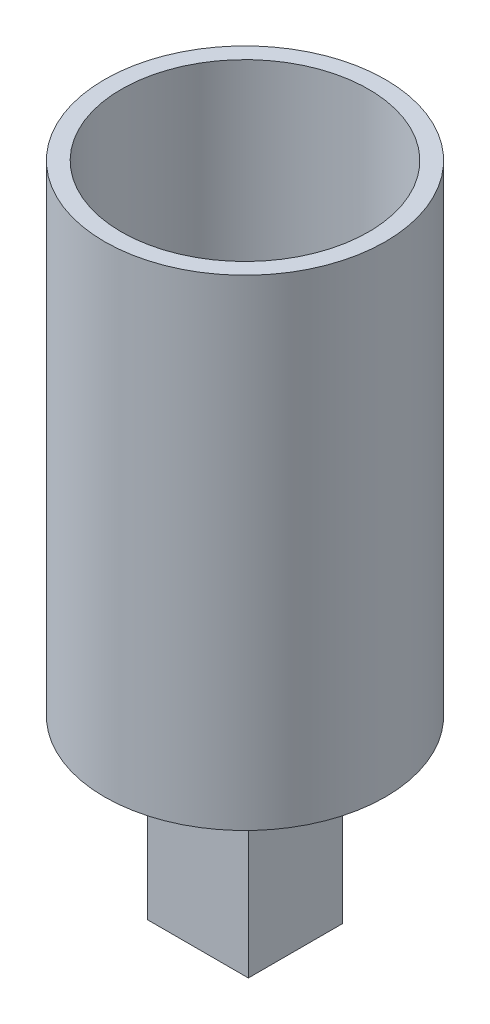
ISO-10303-21;
HEADER;
FILE_DESCRIPTION(('STEP AP214'),'2;1');
FILE_NAME('part.step','',(''),(''),'','','');
FILE_SCHEMA(('AUTOMOTIVE_DESIGN { 1 0 10303 214 1 1 1 1 }'));
ENDSEC;
DATA;
#1=APPLICATION_CONTEXT('core data for automotive mechanical design processes');
#2=APPLICATION_PROTOCOL_DEFINITION('international standard','automotive_design',2000,#1);
#3=PRODUCT_CONTEXT('',#1,'mechanical');
#4=PRODUCT('Part','Part','',(#3));
#5=PRODUCT_RELATED_PRODUCT_CATEGORY('part','',(#4));
#6=PRODUCT_DEFINITION_FORMATION('','',#4);
#7=PRODUCT_DEFINITION_CONTEXT('part definition',#1,'design');
#8=PRODUCT_DEFINITION('design','',#6,#7);
#9=PRODUCT_DEFINITION_SHAPE('','',#8);
#10=(LENGTH_UNIT() NAMED_UNIT(*) SI_UNIT(.MILLI.,.METRE.));
#11=(NAMED_UNIT(*) PLANE_ANGLE_UNIT() SI_UNIT($,.RADIAN.));
#12=(NAMED_UNIT(*) SI_UNIT($,.STERADIAN.) SOLID_ANGLE_UNIT());
#13=UNCERTAINTY_MEASURE_WITH_UNIT(LENGTH_MEASURE(1.E-05),#10,'distance_accuracy_value','');
#14=(GEOMETRIC_REPRESENTATION_CONTEXT(3) GLOBAL_UNCERTAINTY_ASSIGNED_CONTEXT((#13)) GLOBAL_UNIT_ASSIGNED_CONTEXT((#10,
#11,#12)) REPRESENTATION_CONTEXT('',''));
#15=CARTESIAN_POINT('',(0.,0.,0.));
#16=DIRECTION('',(0.,0.,1.));
#17=DIRECTION('',(1.,0.,0.));
#18=AXIS2_PLACEMENT_3D('',#15,#16,#17);
#19=CARTESIAN_POINT('',(8.49999999999998,-142.99499992,-9.00000000000003));
#20=DIRECTION('',(0.,1.,0.));
#21=DIRECTION('',(-1.,0.,0.));
#22=AXIS2_PLACEMENT_3D('',#19,#20,#21);
#23=PLANE('',#22);
#24=CARTESIAN_POINT('',(0.,-142.99499992,0.));
#25=DIRECTION('',(0.,1.,0.));
#26=DIRECTION('',(0.,0.,1.));
#27=AXIS2_PLACEMENT_3D('',#24,#25,#26);
#28=CIRCLE('',#27,41.765999938);
#29=CARTESIAN_POINT('',(0.,-142.99499992,41.765999938));
#30=VERTEX_POINT('',#29);
#31=EDGE_CURVE('E42',#30,#30,#28,.F.);
#32=ORIENTED_EDGE('',*,*,#31,.T.);
#33=EDGE_LOOP('',(#32));
#34=FACE_BOUND('',#33,.T.);
#35=DIRECTION('',(1.,0.,0.));
#36=VECTOR('',#35,1.);
#37=CARTESIAN_POINT('',(15.,-142.99499992,-14.));
#38=LINE('',#37,#36);
#39=CARTESIAN_POINT('',(-15.,-142.99499992,-14.));
#40=VERTEX_POINT('',#39);
#41=CARTESIAN_POINT('',(15.,-142.99499992,-14.));
#42=VERTEX_POINT('',#41);
#43=EDGE_CURVE('E140',#40,#42,#38,.T.);
#44=ORIENTED_EDGE('',*,*,#43,.F.);
#45=DIRECTION('',(0.,0.,-1.));
#46=VECTOR('',#45,1.);
#47=CARTESIAN_POINT('',(-15.,-142.99499992,-14.));
#48=LINE('',#47,#46);
#49=CARTESIAN_POINT('',(-15.,-142.99499992,14.));
#50=VERTEX_POINT('',#49);
#51=EDGE_CURVE('E168',#50,#40,#48,.T.);
#52=ORIENTED_EDGE('',*,*,#51,.F.);
#53=DIRECTION('',(-1.,0.,0.));
#54=VECTOR('',#53,1.);
#55=CARTESIAN_POINT('',(15.,-142.99499992,14.));
#56=LINE('',#55,#54);
#57=CARTESIAN_POINT('',(15.,-142.99499992,14.));
#58=VERTEX_POINT('',#57);
#59=EDGE_CURVE('E54',#58,#50,#56,.T.);
#60=ORIENTED_EDGE('',*,*,#59,.F.);
#61=DIRECTION('',(0.,0.,1.));
#62=VECTOR('',#61,1.);
#63=CARTESIAN_POINT('',(15.,-142.99499992,-14.));
#64=LINE('',#63,#62);
#65=EDGE_CURVE('E49',#42,#58,#64,.T.);
#66=ORIENTED_EDGE('',*,*,#65,.F.);
#67=EDGE_LOOP('',(#44,#52,#60,#66));
#68=FACE_BOUND('',#67,.T.);
#69=ADVANCED_FACE('F34',(#34,#68),#23,.F.);
#70=CARTESIAN_POINT('',(0.,-261.127087036787,0.));
#71=DIRECTION('',(0.,1.,0.));
#72=DIRECTION('',(0.,0.,1.));
#73=AXIS2_PLACEMENT_3D('',#70,#71,#72);
#74=CYLINDRICAL_SURFACE('',#73,36.765999938);
#75=CARTESIAN_POINT('',(0.,0.,0.));
#76=DIRECTION('',(0.,1.,0.));
#77=DIRECTION('',(0.,0.,1.));
#78=AXIS2_PLACEMENT_3D('',#75,#76,#77);
#79=CIRCLE('',#78,36.765999938);
#80=CARTESIAN_POINT('',(0.,0.,36.765999938));
#81=VERTEX_POINT('',#80);
#82=EDGE_CURVE('E222',#81,#81,#79,.T.);
#83=ORIENTED_EDGE('',*,*,#82,.T.);
#84=EDGE_LOOP('',(#83));
#85=FACE_BOUND('',#84,.T.);
#86=CARTESIAN_POINT('',(0.,-137.99499992,0.));
#87=DIRECTION('',(0.,-1.,0.));
#88=DIRECTION('',(0.,0.,-1.));
#89=AXIS2_PLACEMENT_3D('',#86,#87,#88);
#90=CIRCLE('',#89,36.765999938);
#91=CARTESIAN_POINT('',(0.,-137.99499992,-36.765999938));
#92=VERTEX_POINT('',#91);
#93=EDGE_CURVE('E11',#92,#92,#90,.F.);
#94=ORIENTED_EDGE('',*,*,#93,.F.);
#95=EDGE_LOOP('',(#94));
#96=FACE_BOUND('',#95,.T.);
#97=ADVANCED_FACE('F233',(#85,#96),#74,.F.);
#98=CARTESIAN_POINT('',(0.,-261.127087036787,0.));
#99=DIRECTION('',(0.,1.,0.));
#100=DIRECTION('',(0.,0.,1.));
#101=AXIS2_PLACEMENT_3D('',#98,#99,#100);
#102=CYLINDRICAL_SURFACE('',#101,41.765999938);
#103=ORIENTED_EDGE('',*,*,#31,.F.);
#104=EDGE_LOOP('',(#103));
#105=FACE_BOUND('',#104,.T.);
#106=CARTESIAN_POINT('',(0.,0.,0.));
#107=DIRECTION('',(0.,1.,0.));
#108=DIRECTION('',(0.,0.,1.));
#109=AXIS2_PLACEMENT_3D('',#106,#107,#108);
#110=CIRCLE('',#109,41.765999938);
#111=CARTESIAN_POINT('',(0.,0.,41.765999938));
#112=VERTEX_POINT('',#111);
#113=EDGE_CURVE('E225',#112,#112,#110,.T.);
#114=ORIENTED_EDGE('',*,*,#113,.F.);
#115=EDGE_LOOP('',(#114));
#116=FACE_BOUND('',#115,.T.);
#117=ADVANCED_FACE('F36',(#105,#116),#102,.T.);
#118=CARTESIAN_POINT('',(0.,0.,0.));
#119=DIRECTION('',(0.,1.,0.));
#120=DIRECTION('',(0.,0.,1.));
#121=AXIS2_PLACEMENT_3D('',#118,#119,#120);
#122=PLANE('',#121);
#123=ORIENTED_EDGE('',*,*,#82,.F.);
#124=EDGE_LOOP('',(#123));
#125=FACE_BOUND('',#124,.T.);
#126=ORIENTED_EDGE('',*,*,#113,.T.);
#127=EDGE_LOOP('',(#126));
#128=FACE_BOUND('',#127,.T.);
#129=ADVANCED_FACE('F230',(#125,#128),#122,.T.);
#130=DIRECTION('',(0.,0.,-1.));
#131=VECTOR('',#130,1.);
#132=CARTESIAN_POINT('',(-10.,-142.99499992,-9.00000000000003));
#133=LINE('',#132,#131);
#134=CARTESIAN_POINT('',(-10.,-142.99499992,8.99999999999996));
#135=VERTEX_POINT('',#134);
#136=CARTESIAN_POINT('',(-10.,-142.99499992,-9.00000000000005));
#137=VERTEX_POINT('',#136);
#138=EDGE_CURVE('E133',#135,#137,#133,.T.);
#139=ORIENTED_EDGE('',*,*,#138,.T.);
#140=DIRECTION('',(1.,0.,0.));
#141=VECTOR('',#140,1.);
#142=CARTESIAN_POINT('',(10.,-142.99499992,-9.00000000000003));
#143=LINE('',#142,#141);
#144=CARTESIAN_POINT('',(10.,-142.99499992,-9.00000000000003));
#145=VERTEX_POINT('',#144);
#146=EDGE_CURVE('E152',#137,#145,#143,.T.);
#147=ORIENTED_EDGE('',*,*,#146,.T.);
#148=DIRECTION('',(0.,0.,1.));
#149=VECTOR('',#148,1.);
#150=CARTESIAN_POINT('',(10.,-142.99499992,-9.00000000000003));
#151=LINE('',#150,#149);
#152=CARTESIAN_POINT('',(10.,-142.99499992,8.99999999999997));
#153=VERTEX_POINT('',#152);
#154=EDGE_CURVE('E139',#145,#153,#151,.T.);
#155=ORIENTED_EDGE('',*,*,#154,.T.);
#156=DIRECTION('',(-1.,0.,0.));
#157=VECTOR('',#156,1.);
#158=CARTESIAN_POINT('',(10.,-142.99499992,8.99999999999997));
#159=LINE('',#158,#157);
#160=EDGE_CURVE('E155',#153,#135,#159,.T.);
#161=ORIENTED_EDGE('',*,*,#160,.T.);
#162=EDGE_LOOP('',(#139,#147,#155,#161));
#163=FACE_BOUND('',#162,.T.);
#164=DIRECTION('',(0.,0.,1.));
#165=VECTOR('',#164,1.);
#166=CARTESIAN_POINT('',(6.,-142.99499992,-6.00000000000003));
#167=LINE('',#166,#165);
#168=CARTESIAN_POINT('',(6.,-142.99499992,-6.00000000000003));
#169=VERTEX_POINT('',#168);
#170=CARTESIAN_POINT('',(6.,-142.99499992,5.99999999999998));
#171=VERTEX_POINT('',#170);
#172=EDGE_CURVE('E201',#169,#171,#167,.T.);
#173=ORIENTED_EDGE('',*,*,#172,.F.);
#174=DIRECTION('',(1.,0.,0.));
#175=VECTOR('',#174,1.);
#176=CARTESIAN_POINT('',(6.,-142.99499992,-6.00000000000003));
#177=LINE('',#176,#175);
#178=CARTESIAN_POINT('',(-6.,-142.99499992,-6.00000000000003));
#179=VERTEX_POINT('',#178);
#180=EDGE_CURVE('E199',#179,#169,#177,.T.);
#181=ORIENTED_EDGE('',*,*,#180,.F.);
#182=DIRECTION('',(0.,0.,-1.));
#183=VECTOR('',#182,1.);
#184=CARTESIAN_POINT('',(-6.,-142.99499992,-6.00000000000003));
#185=LINE('',#184,#183);
#186=CARTESIAN_POINT('',(-6.,-142.99499992,5.99999999999997));
#187=VERTEX_POINT('',#186);
#188=EDGE_CURVE('E207',#187,#179,#185,.T.);
#189=ORIENTED_EDGE('',*,*,#188,.F.);
#190=DIRECTION('',(-1.,0.,0.));
#191=VECTOR('',#190,1.);
#192=CARTESIAN_POINT('',(6.,-142.99499992,5.99999999999998));
#193=LINE('',#192,#191);
#194=EDGE_CURVE('E204',#171,#187,#193,.T.);
#195=ORIENTED_EDGE('',*,*,#194,.F.);
#196=EDGE_LOOP('',(#173,#181,#189,#195));
#197=FACE_BOUND('',#196,.T.);
#198=ADVANCED_FACE('F239',(#163,#197),#23,.F.);
#199=CARTESIAN_POINT('',(0.,-137.99499992,0.));
#200=DIRECTION('',(0.,-1.,0.));
#201=DIRECTION('',(0.,0.,-1.));
#202=AXIS2_PLACEMENT_3D('',#199,#200,#201);
#203=PLANE('',#202);
#204=DIRECTION('',(0.,0.,1.));
#205=VECTOR('',#204,1.);
#206=CARTESIAN_POINT('',(-6.,-137.99499992,-6.00000000000003));
#207=LINE('',#206,#205);
#208=CARTESIAN_POINT('',(-6.,-137.99499992,-6.00000000000003));
#209=VERTEX_POINT('',#208);
#210=CARTESIAN_POINT('',(-6.,-137.99499992,5.99999999999998));
#211=VERTEX_POINT('',#210);
#212=EDGE_CURVE('E193',#209,#211,#207,.T.);
#213=ORIENTED_EDGE('',*,*,#212,.F.);
#214=DIRECTION('',(-1.,0.,0.));
#215=VECTOR('',#214,1.);
#216=CARTESIAN_POINT('',(6.,-137.99499992,-6.00000000000003));
#217=LINE('',#216,#215);
#218=CARTESIAN_POINT('',(6.,-137.99499992,-6.00000000000003));
#219=VERTEX_POINT('',#218);
#220=EDGE_CURVE('E196',#219,#209,#217,.T.);
#221=ORIENTED_EDGE('',*,*,#220,.F.);
#222=DIRECTION('',(0.,0.,-1.));
#223=VECTOR('',#222,1.);
#224=CARTESIAN_POINT('',(6.,-137.99499992,-6.00000000000003));
#225=LINE('',#224,#223);
#226=CARTESIAN_POINT('',(6.,-137.99499992,5.99999999999998));
#227=VERTEX_POINT('',#226);
#228=EDGE_CURVE('E213',#227,#219,#225,.T.);
#229=ORIENTED_EDGE('',*,*,#228,.F.);
#230=DIRECTION('',(1.,0.,0.));
#231=VECTOR('',#230,1.);
#232=CARTESIAN_POINT('',(6.,-137.99499992,5.99999999999998));
#233=LINE('',#232,#231);
#234=EDGE_CURVE('E191',#211,#227,#233,.T.);
#235=ORIENTED_EDGE('',*,*,#234,.F.);
#236=EDGE_LOOP('',(#213,#221,#229,#235));
#237=FACE_BOUND('',#236,.T.);
#238=ORIENTED_EDGE('',*,*,#93,.T.);
#239=EDGE_LOOP('',(#238));
#240=FACE_BOUND('',#239,.T.);
#241=ADVANCED_FACE('F251',(#237,#240),#203,.F.);
#242=CARTESIAN_POINT('',(6.,0.001000000000001,-6.));
#243=DIRECTION('',(0.,0.,-1.));
#244=DIRECTION('',(0.,1.,0.));
#245=AXIS2_PLACEMENT_3D('',#242,#243,#244);
#246=PLANE('',#245);
#247=ORIENTED_EDGE('',*,*,#220,.T.);
#248=DIRECTION('',(0.,-1.,0.));
#249=VECTOR('',#248,1.);
#250=CARTESIAN_POINT('',(-6.,0.001000000000001,-6.));
#251=LINE('',#250,#249);
#252=EDGE_CURVE('E211',#209,#179,#251,.T.);
#253=ORIENTED_EDGE('',*,*,#252,.T.);
#254=ORIENTED_EDGE('',*,*,#180,.T.);
#255=DIRECTION('',(0.,-1.,0.));
#256=VECTOR('',#255,1.);
#257=CARTESIAN_POINT('',(6.,0.001000000000001,-6.));
#258=LINE('',#257,#256);
#259=EDGE_CURVE('E210',#219,#169,#258,.T.);
#260=ORIENTED_EDGE('',*,*,#259,.F.);
#261=EDGE_LOOP('',(#247,#253,#254,#260));
#262=FACE_BOUND('',#261,.T.);
#263=ADVANCED_FACE('F256',(#262),#246,.F.);
#264=CARTESIAN_POINT('',(-6.,0.001000000000001,-6.));
#265=DIRECTION('',(-1.,0.,0.));
#266=DIRECTION('',(0.,-1.,0.));
#267=AXIS2_PLACEMENT_3D('',#264,#265,#266);
#268=PLANE('',#267);
#269=ORIENTED_EDGE('',*,*,#212,.T.);
#270=DIRECTION('',(0.,-1.,0.));
#271=VECTOR('',#270,1.);
#272=CARTESIAN_POINT('',(-6.,0.001000000000001,6.00000000000001));
#273=LINE('',#272,#271);
#274=EDGE_CURVE('E214',#211,#187,#273,.T.);
#275=ORIENTED_EDGE('',*,*,#274,.T.);
#276=ORIENTED_EDGE('',*,*,#188,.T.);
#277=ORIENTED_EDGE('',*,*,#252,.F.);
#278=EDGE_LOOP('',(#269,#275,#276,#277));
#279=FACE_BOUND('',#278,.T.);
#280=ADVANCED_FACE('F272',(#279),#268,.F.);
#281=CARTESIAN_POINT('',(6.,0.001000000000001,6.00000000000001));
#282=DIRECTION('',(0.,0.,1.));
#283=DIRECTION('',(1.,0.,0.));
#284=AXIS2_PLACEMENT_3D('',#281,#282,#283);
#285=PLANE('',#284);
#286=ORIENTED_EDGE('',*,*,#234,.T.);
#287=DIRECTION('',(0.,-1.,0.));
#288=VECTOR('',#287,1.);
#289=CARTESIAN_POINT('',(6.,0.001000000000001,6.00000000000001));
#290=LINE('',#289,#288);
#291=EDGE_CURVE('E216',#227,#171,#290,.T.);
#292=ORIENTED_EDGE('',*,*,#291,.T.);
#293=ORIENTED_EDGE('',*,*,#194,.T.);
#294=ORIENTED_EDGE('',*,*,#274,.F.);
#295=EDGE_LOOP('',(#286,#292,#293,#294));
#296=FACE_BOUND('',#295,.T.);
#297=ADVANCED_FACE('F275',(#296),#285,.F.);
#298=CARTESIAN_POINT('',(6.,0.001000000000001,-6.));
#299=DIRECTION('',(1.,0.,0.));
#300=DIRECTION('',(0.,1.,0.));
#301=AXIS2_PLACEMENT_3D('',#298,#299,#300);
#302=PLANE('',#301);
#303=ORIENTED_EDGE('',*,*,#228,.T.);
#304=ORIENTED_EDGE('',*,*,#259,.T.);
#305=ORIENTED_EDGE('',*,*,#172,.T.);
#306=ORIENTED_EDGE('',*,*,#291,.F.);
#307=EDGE_LOOP('',(#303,#304,#305,#306));
#308=FACE_BOUND('',#307,.T.);
#309=ADVANCED_FACE('F266',(#308),#302,.F.);
#310=CARTESIAN_POINT('',(0.,-195.99499992,0.));
#311=DIRECTION('',(0.,1.,0.));
#312=DIRECTION('',(0.,0.,1.));
#313=AXIS2_PLACEMENT_3D('',#310,#311,#312);
#314=PLANE('',#313);
#315=DIRECTION('',(1.,0.,0.));
#316=VECTOR('',#315,1.);
#317=CARTESIAN_POINT('',(15.,-195.99499992,-14.));
#318=LINE('',#317,#316);
#319=CARTESIAN_POINT('',(-15.,-195.99499992,-14.));
#320=VERTEX_POINT('',#319);
#321=CARTESIAN_POINT('',(15.,-195.99499992,-14.));
#322=VERTEX_POINT('',#321);
#323=EDGE_CURVE('E164',#320,#322,#318,.T.);
#324=ORIENTED_EDGE('',*,*,#323,.T.);
#325=DIRECTION('',(0.,0.,1.));
#326=VECTOR('',#325,1.);
#327=CARTESIAN_POINT('',(15.,-195.99499992,-14.));
#328=LINE('',#327,#326);
#329=CARTESIAN_POINT('',(15.,-195.99499992,14.));
#330=VERTEX_POINT('',#329);
#331=EDGE_CURVE('E167',#322,#330,#328,.T.);
#332=ORIENTED_EDGE('',*,*,#331,.T.);
#333=DIRECTION('',(-1.,0.,0.));
#334=VECTOR('',#333,1.);
#335=CARTESIAN_POINT('',(15.,-195.99499992,14.));
#336=LINE('',#335,#334);
#337=CARTESIAN_POINT('',(-15.,-195.99499992,14.));
#338=VERTEX_POINT('',#337);
#339=EDGE_CURVE('E170',#330,#338,#336,.T.);
#340=ORIENTED_EDGE('',*,*,#339,.T.);
#341=DIRECTION('',(0.,0.,-1.));
#342=VECTOR('',#341,1.);
#343=CARTESIAN_POINT('',(-15.,-195.99499992,-14.));
#344=LINE('',#343,#342);
#345=EDGE_CURVE('E172',#338,#320,#344,.T.);
#346=ORIENTED_EDGE('',*,*,#345,.T.);
#347=EDGE_LOOP('',(#324,#332,#340,#346));
#348=FACE_BOUND('',#347,.T.);
#349=DIRECTION('',(1.,0.,0.));
#350=VECTOR('',#349,1.);
#351=CARTESIAN_POINT('',(10.,-195.99499992,-9.00000000000004));
#352=LINE('',#351,#350);
#353=CARTESIAN_POINT('',(-10.,-195.99499992,-9.00000000000005));
#354=VERTEX_POINT('',#353);
#355=CARTESIAN_POINT('',(10.,-195.99499992,-9.00000000000004));
#356=VERTEX_POINT('',#355);
#357=EDGE_CURVE('E122',#354,#356,#352,.T.);
#358=ORIENTED_EDGE('',*,*,#357,.F.);
#359=DIRECTION('',(0.,0.,-1.));
#360=VECTOR('',#359,1.);
#361=CARTESIAN_POINT('',(-10.,-195.99499992,-9.00000000000005));
#362=LINE('',#361,#360);
#363=CARTESIAN_POINT('',(-10.,-195.99499992,8.99999999999996));
#364=VERTEX_POINT('',#363);
#365=EDGE_CURVE('E148',#364,#354,#362,.T.);
#366=ORIENTED_EDGE('',*,*,#365,.F.);
#367=DIRECTION('',(-1.,0.,0.));
#368=VECTOR('',#367,1.);
#369=CARTESIAN_POINT('',(10.,-195.99499992,8.99999999999996));
#370=LINE('',#369,#368);
#371=CARTESIAN_POINT('',(10.,-195.99499992,8.99999999999996));
#372=VERTEX_POINT('',#371);
#373=EDGE_CURVE('E146',#372,#364,#370,.T.);
#374=ORIENTED_EDGE('',*,*,#373,.F.);
#375=DIRECTION('',(0.,0.,1.));
#376=VECTOR('',#375,1.);
#377=CARTESIAN_POINT('',(10.,-195.99499992,-9.00000000000004));
#378=LINE('',#377,#376);
#379=EDGE_CURVE('E132',#356,#372,#378,.T.);
#380=ORIENTED_EDGE('',*,*,#379,.F.);
#381=EDGE_LOOP('',(#358,#366,#374,#380));
#382=FACE_BOUND('',#381,.T.);
#383=ADVANCED_FACE('F144',(#348,#382),#314,.F.);
#384=CARTESIAN_POINT('',(15.,-195.99499992,-14.));
#385=DIRECTION('',(0.,0.,1.));
#386=DIRECTION('',(0.,-1.,0.));
#387=AXIS2_PLACEMENT_3D('',#384,#385,#386);
#388=PLANE('',#387);
#389=ORIENTED_EDGE('',*,*,#43,.T.);
#390=DIRECTION('',(0.,1.,0.));
#391=VECTOR('',#390,1.);
#392=CARTESIAN_POINT('',(15.,-195.99499992,-14.));
#393=LINE('',#392,#391);
#394=EDGE_CURVE('E189',#322,#42,#393,.T.);
#395=ORIENTED_EDGE('',*,*,#394,.F.);
#396=ORIENTED_EDGE('',*,*,#323,.F.);
#397=DIRECTION('',(0.,1.,0.));
#398=VECTOR('',#397,1.);
#399=CARTESIAN_POINT('',(-15.,-195.99499992,-14.));
#400=LINE('',#399,#398);
#401=EDGE_CURVE('E174',#320,#40,#400,.T.);
#402=ORIENTED_EDGE('',*,*,#401,.T.);
#403=EDGE_LOOP('',(#389,#395,#396,#402));
#404=FACE_BOUND('',#403,.T.);
#405=ADVANCED_FACE('F330',(#404),#388,.F.);
#406=CARTESIAN_POINT('',(15.,-195.99499992,-14.));
#407=DIRECTION('',(-1.,0.,0.));
#408=DIRECTION('',(0.,-1.,0.));
#409=AXIS2_PLACEMENT_3D('',#406,#407,#408);
#410=PLANE('',#409);
#411=ORIENTED_EDGE('',*,*,#65,.T.);
#412=DIRECTION('',(0.,1.,0.));
#413=VECTOR('',#412,1.);
#414=CARTESIAN_POINT('',(15.,-195.99499992,14.));
#415=LINE('',#414,#413);
#416=EDGE_CURVE('E186',#330,#58,#415,.T.);
#417=ORIENTED_EDGE('',*,*,#416,.F.);
#418=ORIENTED_EDGE('',*,*,#331,.F.);
#419=ORIENTED_EDGE('',*,*,#394,.T.);
#420=EDGE_LOOP('',(#411,#417,#418,#419));
#421=FACE_BOUND('',#420,.T.);
#422=ADVANCED_FACE('F340',(#421),#410,.F.);
#423=CARTESIAN_POINT('',(15.,-195.99499992,14.));
#424=DIRECTION('',(0.,0.,-1.));
#425=DIRECTION('',(-1.,0.,0.));
#426=AXIS2_PLACEMENT_3D('',#423,#424,#425);
#427=PLANE('',#426);
#428=ORIENTED_EDGE('',*,*,#59,.T.);
#429=DIRECTION('',(0.,1.,0.));
#430=VECTOR('',#429,1.);
#431=CARTESIAN_POINT('',(-15.,-195.99499992,14.));
#432=LINE('',#431,#430);
#433=EDGE_CURVE('E183',#338,#50,#432,.T.);
#434=ORIENTED_EDGE('',*,*,#433,.F.);
#435=ORIENTED_EDGE('',*,*,#339,.F.);
#436=ORIENTED_EDGE('',*,*,#416,.T.);
#437=EDGE_LOOP('',(#428,#434,#435,#436));
#438=FACE_BOUND('',#437,.T.);
#439=ADVANCED_FACE('F349',(#438),#427,.F.);
#440=CARTESIAN_POINT('',(-15.,-195.99499992,-14.));
#441=DIRECTION('',(1.,0.,0.));
#442=DIRECTION('',(0.,1.,0.));
#443=AXIS2_PLACEMENT_3D('',#440,#441,#442);
#444=PLANE('',#443);
#445=ORIENTED_EDGE('',*,*,#51,.T.);
#446=ORIENTED_EDGE('',*,*,#401,.F.);
#447=ORIENTED_EDGE('',*,*,#345,.F.);
#448=ORIENTED_EDGE('',*,*,#433,.T.);
#449=EDGE_LOOP('',(#445,#446,#447,#448));
#450=FACE_BOUND('',#449,.T.);
#451=ADVANCED_FACE('F359',(#450),#444,.F.);
#452=CARTESIAN_POINT('',(10.,-195.99499992,-9.00000000000004));
#453=DIRECTION('',(0.,0.,1.));
#454=DIRECTION('',(0.,-1.,0.));
#455=AXIS2_PLACEMENT_3D('',#452,#453,#454);
#456=PLANE('',#455);
#457=ORIENTED_EDGE('',*,*,#146,.F.);
#458=DIRECTION('',(0.,1.,0.));
#459=VECTOR('',#458,1.);
#460=CARTESIAN_POINT('',(-10.,-195.99499992,-9.00000000000005));
#461=LINE('',#460,#459);
#462=EDGE_CURVE('E128',#354,#137,#461,.T.);
#463=ORIENTED_EDGE('',*,*,#462,.F.);
#464=ORIENTED_EDGE('',*,*,#357,.T.);
#465=DIRECTION('',(0.,1.,0.));
#466=VECTOR('',#465,1.);
#467=CARTESIAN_POINT('',(10.,-195.99499992,-9.00000000000004));
#468=LINE('',#467,#466);
#469=EDGE_CURVE('E126',#356,#145,#468,.T.);
#470=ORIENTED_EDGE('',*,*,#469,.T.);
#471=EDGE_LOOP('',(#457,#463,#464,#470));
#472=FACE_BOUND('',#471,.T.);
#473=ADVANCED_FACE('F125',(#472),#456,.T.);
#474=CARTESIAN_POINT('',(10.,-195.99499992,-9.00000000000004));
#475=DIRECTION('',(-1.,0.,0.));
#476=DIRECTION('',(0.,-1.,0.));
#477=AXIS2_PLACEMENT_3D('',#474,#475,#476);
#478=PLANE('',#477);
#479=ORIENTED_EDGE('',*,*,#154,.F.);
#480=ORIENTED_EDGE('',*,*,#469,.F.);
#481=ORIENTED_EDGE('',*,*,#379,.T.);
#482=DIRECTION('',(0.,1.,0.));
#483=VECTOR('',#482,1.);
#484=CARTESIAN_POINT('',(10.,-195.99499992,8.99999999999996));
#485=LINE('',#484,#483);
#486=EDGE_CURVE('E141',#372,#153,#485,.T.);
#487=ORIENTED_EDGE('',*,*,#486,.T.);
#488=EDGE_LOOP('',(#479,#480,#481,#487));
#489=FACE_BOUND('',#488,.T.);
#490=ADVANCED_FACE('F136',(#489),#478,.T.);
#491=CARTESIAN_POINT('',(10.,-195.99499992,8.99999999999996));
#492=DIRECTION('',(0.,0.,-1.));
#493=DIRECTION('',(0.,1.,0.));
#494=AXIS2_PLACEMENT_3D('',#491,#492,#493);
#495=PLANE('',#494);
#496=ORIENTED_EDGE('',*,*,#160,.F.);
#497=ORIENTED_EDGE('',*,*,#486,.F.);
#498=ORIENTED_EDGE('',*,*,#373,.T.);
#499=DIRECTION('',(0.,1.,0.));
#500=VECTOR('',#499,1.);
#501=CARTESIAN_POINT('',(-10.,-195.99499992,8.99999999999995));
#502=LINE('',#501,#500);
#503=EDGE_CURVE('E161',#364,#135,#502,.T.);
#504=ORIENTED_EDGE('',*,*,#503,.T.);
#505=EDGE_LOOP('',(#496,#497,#498,#504));
#506=FACE_BOUND('',#505,.T.);
#507=ADVANCED_FACE('F386',(#506),#495,.T.);
#508=CARTESIAN_POINT('',(-10.,-195.99499992,-9.00000000000005));
#509=DIRECTION('',(1.,0.,0.));
#510=DIRECTION('',(0.,1.,0.));
#511=AXIS2_PLACEMENT_3D('',#508,#509,#510);
#512=PLANE('',#511);
#513=ORIENTED_EDGE('',*,*,#138,.F.);
#514=ORIENTED_EDGE('',*,*,#503,.F.);
#515=ORIENTED_EDGE('',*,*,#365,.T.);
#516=ORIENTED_EDGE('',*,*,#462,.T.);
#517=EDGE_LOOP('',(#513,#514,#515,#516));
#518=FACE_BOUND('',#517,.T.);
#519=ADVANCED_FACE('F395',(#518),#512,.T.);
#520=CLOSED_SHELL('',(#69,#97,#117,#129,#198,#241,#263,#280,#297,#309,#383,#405,#422,#439,#451,
#473,#490,#507,#519));
#521=MANIFOLD_SOLID_BREP('B2',#520);
#522=ADVANCED_BREP_SHAPE_REPRESENTATION('',(#18,#521),#14);
#523=SHAPE_DEFINITION_REPRESENTATION(#9,#522);
ENDSEC;
END-ISO-10303-21;
